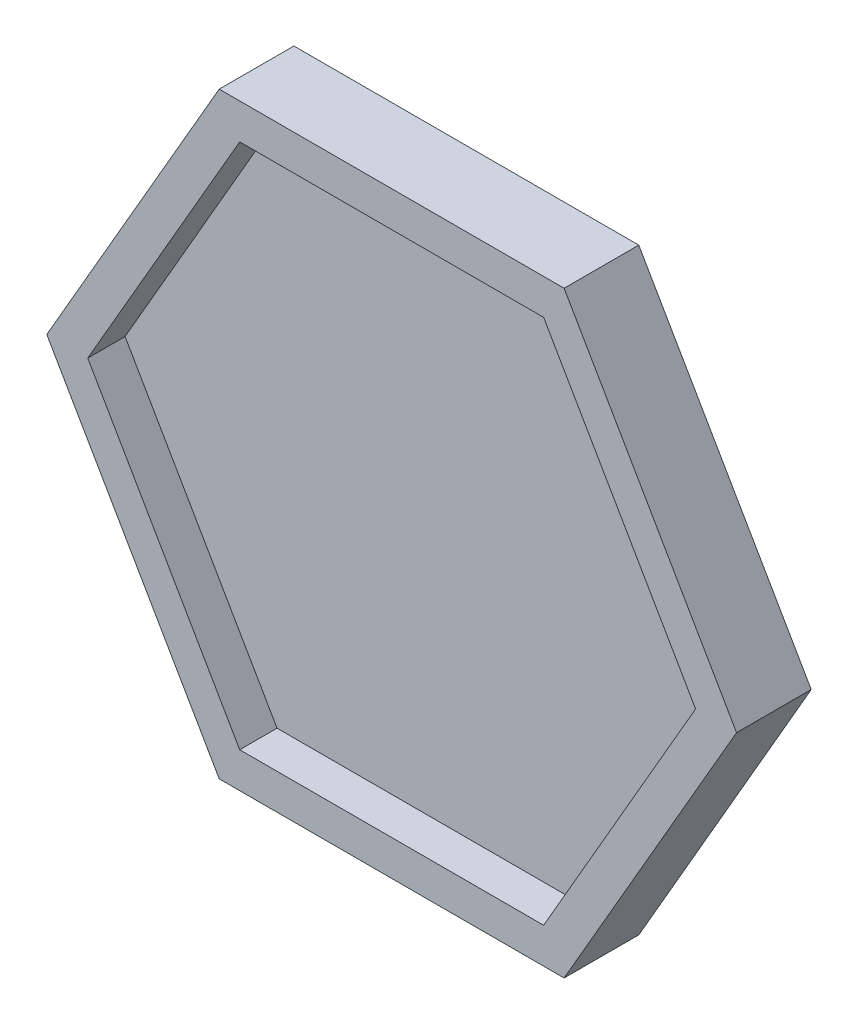
ISO-10303-21;
HEADER;
FILE_DESCRIPTION(('STEP AP214'),'2;1');
FILE_NAME('part.step','',(''),(''),'','','');
FILE_SCHEMA(('AUTOMOTIVE_DESIGN { 1 0 10303 214 1 1 1 1 }'));
ENDSEC;
DATA;
#1=APPLICATION_CONTEXT('core data for automotive mechanical design processes');
#2=APPLICATION_PROTOCOL_DEFINITION('international standard','automotive_design',2000,#1);
#3=PRODUCT_CONTEXT('',#1,'mechanical');
#4=PRODUCT('Part','Part','',(#3));
#5=PRODUCT_RELATED_PRODUCT_CATEGORY('part','',(#4));
#6=PRODUCT_DEFINITION_FORMATION('','',#4);
#7=PRODUCT_DEFINITION_CONTEXT('part definition',#1,'design');
#8=PRODUCT_DEFINITION('design','',#6,#7);
#9=PRODUCT_DEFINITION_SHAPE('','',#8);
#10=(LENGTH_UNIT() NAMED_UNIT(*) SI_UNIT(.MILLI.,.METRE.));
#11=(NAMED_UNIT(*) PLANE_ANGLE_UNIT() SI_UNIT($,.RADIAN.));
#12=(NAMED_UNIT(*) SI_UNIT($,.STERADIAN.) SOLID_ANGLE_UNIT());
#13=UNCERTAINTY_MEASURE_WITH_UNIT(LENGTH_MEASURE(1.E-05),#10,'distance_accuracy_value','');
#14=(GEOMETRIC_REPRESENTATION_CONTEXT(3) GLOBAL_UNCERTAINTY_ASSIGNED_CONTEXT((#13)) GLOBAL_UNIT_ASSIGNED_CONTEXT((#10,
#11,#12)) REPRESENTATION_CONTEXT('',''));
#15=CARTESIAN_POINT('',(0.,0.,0.));
#16=DIRECTION('',(0.,0.,1.));
#17=DIRECTION('',(1.,0.,0.));
#18=AXIS2_PLACEMENT_3D('',#15,#16,#17);
#19=CARTESIAN_POINT('',(0.,0.,-2.5));
#20=DIRECTION('',(0.,0.,-1.));
#21=DIRECTION('',(-1.,0.,0.));
#22=AXIS2_PLACEMENT_3D('',#19,#20,#21);
#23=PLANE('',#22);
#24=DIRECTION('',(-0.5,0.866025403784439,0.));
#25=VECTOR('',#24,1.);
#26=CARTESIAN_POINT('',(8.14063879557373,0.,-2.5));
#27=LINE('',#26,#25);
#28=CARTESIAN_POINT('',(8.14063879557373,0.,-2.5));
#29=VERTEX_POINT('',#28);
#30=CARTESIAN_POINT('',(4.07031939778686,7.05000000000001,-2.5));
#31=VERTEX_POINT('',#30);
#32=EDGE_CURVE('E140',#29,#31,#27,.T.);
#33=ORIENTED_EDGE('',*,*,#32,.T.);
#34=DIRECTION('',(-1.,0.,0.));
#35=VECTOR('',#34,1.);
#36=CARTESIAN_POINT('',(4.07031939778686,7.05000000000001,-2.5));
#37=LINE('',#36,#35);
#38=CARTESIAN_POINT('',(-4.07031939778686,7.05000000000001,-2.5));
#39=VERTEX_POINT('',#38);
#40=EDGE_CURVE('E170',#31,#39,#37,.T.);
#41=ORIENTED_EDGE('',*,*,#40,.T.);
#42=DIRECTION('',(-0.5,-0.866025403784439,0.));
#43=VECTOR('',#42,1.);
#44=CARTESIAN_POINT('',(-4.07031939778686,7.05000000000001,-2.5));
#45=LINE('',#44,#43);
#46=CARTESIAN_POINT('',(-8.14063879557373,0.,-2.5));
#47=VERTEX_POINT('',#46);
#48=EDGE_CURVE('E146',#39,#47,#45,.T.);
#49=ORIENTED_EDGE('',*,*,#48,.T.);
#50=DIRECTION('',(0.5,-0.866025403784439,0.));
#51=VECTOR('',#50,1.);
#52=CARTESIAN_POINT('',(-8.14063879557373,0.,-2.5));
#53=LINE('',#52,#51);
#54=CARTESIAN_POINT('',(-4.07031939778687,-7.05,-2.5));
#55=VERTEX_POINT('',#54);
#56=EDGE_CURVE('E175',#47,#55,#53,.T.);
#57=ORIENTED_EDGE('',*,*,#56,.T.);
#58=DIRECTION('',(1.,0.,0.));
#59=VECTOR('',#58,1.);
#60=CARTESIAN_POINT('',(-4.07031939778687,-7.05,-2.5));
#61=LINE('',#60,#59);
#62=CARTESIAN_POINT('',(4.07031939778686,-7.05000000000001,-2.5));
#63=VERTEX_POINT('',#62);
#64=EDGE_CURVE('E179',#55,#63,#61,.T.);
#65=ORIENTED_EDGE('',*,*,#64,.T.);
#66=DIRECTION('',(0.5,0.866025403784439,0.));
#67=VECTOR('',#66,1.);
#68=CARTESIAN_POINT('',(4.07031939778686,-7.05000000000001,-2.5));
#69=LINE('',#68,#67);
#70=EDGE_CURVE('E183',#63,#29,#69,.T.);
#71=ORIENTED_EDGE('',*,*,#70,.T.);
#72=EDGE_LOOP('',(#33,#41,#49,#57,#65,#71));
#73=FACE_BOUND('',#72,.T.);
#74=ADVANCED_FACE('F39',(#73),#23,.F.);
#75=CARTESIAN_POINT('',(0.,0.,-1.5));
#76=DIRECTION('',(0.,0.,1.));
#77=DIRECTION('',(1.,0.,0.));
#78=AXIS2_PLACEMENT_3D('',#75,#76,#77);
#79=PLANE('',#78);
#80=DIRECTION('',(-1.,0.,0.));
#81=VECTOR('',#80,1.);
#82=CARTESIAN_POINT('',(4.61880215351692,8.00000000000006,-1.5));
#83=LINE('',#82,#81);
#84=CARTESIAN_POINT('',(4.61880215351692,8.00000000000006,-1.5));
#85=VERTEX_POINT('',#84);
#86=CARTESIAN_POINT('',(-4.61880215351701,8.00000000000001,-1.5));
#87=VERTEX_POINT('',#86);
#88=EDGE_CURVE('E148',#85,#87,#83,.T.);
#89=ORIENTED_EDGE('',*,*,#88,.T.);
#90=DIRECTION('',(-0.499999999999999,-0.866025403784439,0.));
#91=VECTOR('',#90,1.);
#92=CARTESIAN_POINT('',(-4.61880215351701,8.00000000000001,-1.5));
#93=LINE('',#92,#91);
#94=CARTESIAN_POINT('',(-9.23760430703402,0.,-1.5));
#95=VERTEX_POINT('',#94);
#96=EDGE_CURVE('E206',#87,#95,#93,.T.);
#97=ORIENTED_EDGE('',*,*,#96,.T.);
#98=DIRECTION('',(0.500000000000003,-0.866025403784437,0.));
#99=VECTOR('',#98,1.);
#100=CARTESIAN_POINT('',(-9.23760430703402,0.,-1.5));
#101=LINE('',#100,#99);
#102=CARTESIAN_POINT('',(-4.61880215351698,-8.00000000000003,-1.5));
#103=VERTEX_POINT('',#102);
#104=EDGE_CURVE('E210',#95,#103,#101,.T.);
#105=ORIENTED_EDGE('',*,*,#104,.T.);
#106=DIRECTION('',(1.,0.,0.));
#107=VECTOR('',#106,1.);
#108=CARTESIAN_POINT('',(-4.61880215351698,-8.00000000000003,-1.5));
#109=LINE('',#108,#107);
#110=CARTESIAN_POINT('',(4.61880215351706,-7.99999999999998,-1.5));
#111=VERTEX_POINT('',#110);
#112=EDGE_CURVE('E214',#103,#111,#109,.T.);
#113=ORIENTED_EDGE('',*,*,#112,.T.);
#114=DIRECTION('',(0.499999999999994,0.866025403784442,0.));
#115=VECTOR('',#114,1.);
#116=CARTESIAN_POINT('',(4.61880215351706,-7.99999999999998,-1.5));
#117=LINE('',#116,#115);
#118=CARTESIAN_POINT('',(9.23760430703402,0.,-1.5));
#119=VERTEX_POINT('',#118);
#120=EDGE_CURVE('E218',#111,#119,#117,.T.);
#121=ORIENTED_EDGE('',*,*,#120,.T.);
#122=DIRECTION('',(-0.500000000000009,0.866025403784434,0.));
#123=VECTOR('',#122,1.);
#124=CARTESIAN_POINT('',(9.23760430703402,0.,-1.5));
#125=LINE('',#124,#123);
#126=EDGE_CURVE('E222',#119,#85,#125,.T.);
#127=ORIENTED_EDGE('',*,*,#126,.T.);
#128=EDGE_LOOP('',(#89,#97,#105,#113,#121,#127));
#129=FACE_BOUND('',#128,.T.);
#130=DIRECTION('',(-0.5,-0.866025403784439,0.));
#131=VECTOR('',#130,1.);
#132=CARTESIAN_POINT('',(-4.07031939778686,7.05000000000001,-1.5));
#133=LINE('',#132,#131);
#134=CARTESIAN_POINT('',(-4.07031939778686,7.05000000000001,-1.5));
#135=VERTEX_POINT('',#134);
#136=CARTESIAN_POINT('',(-8.14063879557373,0.,-1.5));
#137=VERTEX_POINT('',#136);
#138=EDGE_CURVE('E139',#135,#137,#133,.T.);
#139=ORIENTED_EDGE('',*,*,#138,.F.);
#140=DIRECTION('',(-1.,0.,0.));
#141=VECTOR('',#140,1.);
#142=CARTESIAN_POINT('',(4.07031939778686,7.05000000000001,-1.5));
#143=LINE('',#142,#141);
#144=CARTESIAN_POINT('',(4.07031939778686,7.05000000000001,-1.5));
#145=VERTEX_POINT('',#144);
#146=EDGE_CURVE('E130',#145,#135,#143,.T.);
#147=ORIENTED_EDGE('',*,*,#146,.F.);
#148=DIRECTION('',(-0.5,0.866025403784439,0.));
#149=VECTOR('',#148,1.);
#150=CARTESIAN_POINT('',(8.14063879557373,0.,-1.5));
#151=LINE('',#150,#149);
#152=CARTESIAN_POINT('',(8.14063879557373,0.,-1.5));
#153=VERTEX_POINT('',#152);
#154=EDGE_CURVE('E167',#153,#145,#151,.T.);
#155=ORIENTED_EDGE('',*,*,#154,.F.);
#156=DIRECTION('',(0.5,0.866025403784439,0.));
#157=VECTOR('',#156,1.);
#158=CARTESIAN_POINT('',(4.07031939778686,-7.05000000000001,-1.5));
#159=LINE('',#158,#157);
#160=CARTESIAN_POINT('',(4.07031939778686,-7.05000000000001,-1.5));
#161=VERTEX_POINT('',#160);
#162=EDGE_CURVE('E163',#161,#153,#159,.T.);
#163=ORIENTED_EDGE('',*,*,#162,.F.);
#164=DIRECTION('',(1.,0.,0.));
#165=VECTOR('',#164,1.);
#166=CARTESIAN_POINT('',(-4.07031939778687,-7.05,-1.5));
#167=LINE('',#166,#165);
#168=CARTESIAN_POINT('',(-4.07031939778687,-7.05,-1.5));
#169=VERTEX_POINT('',#168);
#170=EDGE_CURVE('E158',#169,#161,#167,.T.);
#171=ORIENTED_EDGE('',*,*,#170,.F.);
#172=DIRECTION('',(0.5,-0.866025403784439,0.));
#173=VECTOR('',#172,1.);
#174=CARTESIAN_POINT('',(-8.14063879557373,0.,-1.5));
#175=LINE('',#174,#173);
#176=EDGE_CURVE('E154',#137,#169,#175,.T.);
#177=ORIENTED_EDGE('',*,*,#176,.F.);
#178=EDGE_LOOP('',(#139,#147,#155,#163,#171,#177));
#179=FACE_BOUND('',#178,.T.);
#180=ADVANCED_FACE('F152',(#129,#179),#79,.T.);
#181=CARTESIAN_POINT('',(4.07031939778686,7.05000000000001,-1.5));
#182=DIRECTION('',(0.,-1.,0.));
#183=DIRECTION('',(1.,0.,0.));
#184=AXIS2_PLACEMENT_3D('',#181,#182,#183);
#185=PLANE('',#184);
#186=ORIENTED_EDGE('',*,*,#40,.F.);
#187=DIRECTION('',(0.,0.,-1.));
#188=VECTOR('',#187,1.);
#189=CARTESIAN_POINT('',(4.07031939778686,7.05000000000001,-1.5));
#190=LINE('',#189,#188);
#191=EDGE_CURVE('E55',#145,#31,#190,.T.);
#192=ORIENTED_EDGE('',*,*,#191,.F.);
#193=ORIENTED_EDGE('',*,*,#146,.T.);
#194=DIRECTION('',(0.,0.,-1.));
#195=VECTOR('',#194,1.);
#196=CARTESIAN_POINT('',(-4.07031939778686,7.05000000000001,-1.5));
#197=LINE('',#196,#195);
#198=EDGE_CURVE('E133',#135,#39,#197,.T.);
#199=ORIENTED_EDGE('',*,*,#198,.T.);
#200=EDGE_LOOP('',(#186,#192,#193,#199));
#201=FACE_BOUND('',#200,.T.);
#202=ADVANCED_FACE('F132',(#201),#185,.T.);
#203=CARTESIAN_POINT('',(-4.07031939778686,7.05000000000001,-1.5));
#204=DIRECTION('',(0.866025403784439,-0.5,0.));
#205=DIRECTION('',(0.5,0.866025403784439,0.));
#206=AXIS2_PLACEMENT_3D('',#203,#204,#205);
#207=PLANE('',#206);
#208=ORIENTED_EDGE('',*,*,#48,.F.);
#209=ORIENTED_EDGE('',*,*,#198,.F.);
#210=ORIENTED_EDGE('',*,*,#138,.T.);
#211=DIRECTION('',(0.,0.,-1.));
#212=VECTOR('',#211,1.);
#213=CARTESIAN_POINT('',(-8.14063879557373,0.,-1.5));
#214=LINE('',#213,#212);
#215=EDGE_CURVE('E149',#137,#47,#214,.T.);
#216=ORIENTED_EDGE('',*,*,#215,.T.);
#217=EDGE_LOOP('',(#208,#209,#210,#216));
#218=FACE_BOUND('',#217,.T.);
#219=ADVANCED_FACE('F143',(#218),#207,.T.);
#220=CARTESIAN_POINT('',(-8.14063879557373,0.,-1.5));
#221=DIRECTION('',(0.866025403784439,0.5,0.));
#222=DIRECTION('',(-0.5,0.866025403784439,0.));
#223=AXIS2_PLACEMENT_3D('',#220,#221,#222);
#224=PLANE('',#223);
#225=ORIENTED_EDGE('',*,*,#56,.F.);
#226=ORIENTED_EDGE('',*,*,#215,.F.);
#227=ORIENTED_EDGE('',*,*,#176,.T.);
#228=DIRECTION('',(0.,0.,-1.));
#229=VECTOR('',#228,1.);
#230=CARTESIAN_POINT('',(-4.07031939778687,-7.05,-1.5));
#231=LINE('',#230,#229);
#232=EDGE_CURVE('E198',#169,#55,#231,.T.);
#233=ORIENTED_EDGE('',*,*,#232,.T.);
#234=EDGE_LOOP('',(#225,#226,#227,#233));
#235=FACE_BOUND('',#234,.T.);
#236=ADVANCED_FACE('F306',(#235),#224,.T.);
#237=CARTESIAN_POINT('',(-4.07031939778687,-7.05,-1.5));
#238=DIRECTION('',(0.,1.,0.));
#239=DIRECTION('',(-1.,0.,0.));
#240=AXIS2_PLACEMENT_3D('',#237,#238,#239);
#241=PLANE('',#240);
#242=ORIENTED_EDGE('',*,*,#64,.F.);
#243=ORIENTED_EDGE('',*,*,#232,.F.);
#244=ORIENTED_EDGE('',*,*,#170,.T.);
#245=DIRECTION('',(0.,0.,-1.));
#246=VECTOR('',#245,1.);
#247=CARTESIAN_POINT('',(4.07031939778686,-7.05000000000001,-1.5));
#248=LINE('',#247,#246);
#249=EDGE_CURVE('E195',#161,#63,#248,.T.);
#250=ORIENTED_EDGE('',*,*,#249,.T.);
#251=EDGE_LOOP('',(#242,#243,#244,#250));
#252=FACE_BOUND('',#251,.T.);
#253=ADVANCED_FACE('F309',(#252),#241,.T.);
#254=CARTESIAN_POINT('',(4.07031939778686,-7.05000000000001,-1.5));
#255=DIRECTION('',(-0.866025403784439,0.5,0.));
#256=DIRECTION('',(-0.5,-0.866025403784439,0.));
#257=AXIS2_PLACEMENT_3D('',#254,#255,#256);
#258=PLANE('',#257);
#259=ORIENTED_EDGE('',*,*,#70,.F.);
#260=ORIENTED_EDGE('',*,*,#249,.F.);
#261=ORIENTED_EDGE('',*,*,#162,.T.);
#262=DIRECTION('',(0.,0.,-1.));
#263=VECTOR('',#262,1.);
#264=CARTESIAN_POINT('',(8.14063879557373,0.,-1.5));
#265=LINE('',#264,#263);
#266=EDGE_CURVE('E192',#153,#29,#265,.T.);
#267=ORIENTED_EDGE('',*,*,#266,.T.);
#268=EDGE_LOOP('',(#259,#260,#261,#267));
#269=FACE_BOUND('',#268,.T.);
#270=ADVANCED_FACE('F313',(#269),#258,.T.);
#271=CARTESIAN_POINT('',(8.14063879557373,0.,-1.5));
#272=DIRECTION('',(-0.866025403784439,-0.5,0.));
#273=DIRECTION('',(0.5,-0.866025403784439,0.));
#274=AXIS2_PLACEMENT_3D('',#271,#272,#273);
#275=PLANE('',#274);
#276=ORIENTED_EDGE('',*,*,#32,.F.);
#277=ORIENTED_EDGE('',*,*,#266,.F.);
#278=ORIENTED_EDGE('',*,*,#154,.T.);
#279=ORIENTED_EDGE('',*,*,#191,.T.);
#280=EDGE_LOOP('',(#276,#277,#278,#279));
#281=FACE_BOUND('',#280,.T.);
#282=ADVANCED_FACE('F300',(#281),#275,.T.);
#283=CARTESIAN_POINT('',(0.,0.,-3.5));
#284=DIRECTION('',(0.,0.,-1.));
#285=DIRECTION('',(-1.,0.,0.));
#286=AXIS2_PLACEMENT_3D('',#283,#284,#285);
#287=PLANE('',#286);
#288=DIRECTION('',(-0.5,0.866025403784439,0.));
#289=VECTOR('',#288,1.);
#290=CARTESIAN_POINT('',(-4.61880215351701,-8.00000000000001,-3.5));
#291=LINE('',#290,#289);
#292=CARTESIAN_POINT('',(-4.61880215351701,-8.00000000000001,-3.5));
#293=VERTEX_POINT('',#292);
#294=CARTESIAN_POINT('',(-9.23760430703402,0.,-3.5));
#295=VERTEX_POINT('',#294);
#296=EDGE_CURVE('E226',#293,#295,#291,.T.);
#297=ORIENTED_EDGE('',*,*,#296,.T.);
#298=DIRECTION('',(0.5,0.866025403784439,0.));
#299=VECTOR('',#298,1.);
#300=CARTESIAN_POINT('',(-9.23760430703402,0.,-3.5));
#301=LINE('',#300,#299);
#302=CARTESIAN_POINT('',(-4.61880215351701,8.00000000000001,-3.5));
#303=VERTEX_POINT('',#302);
#304=EDGE_CURVE('E229',#295,#303,#301,.T.);
#305=ORIENTED_EDGE('',*,*,#304,.T.);
#306=DIRECTION('',(1.,0.,0.));
#307=VECTOR('',#306,1.);
#308=CARTESIAN_POINT('',(-4.61880215351701,8.00000000000001,-3.5));
#309=LINE('',#308,#307);
#310=CARTESIAN_POINT('',(4.61880215351701,8.00000000000001,-3.5));
#311=VERTEX_POINT('',#310);
#312=EDGE_CURVE('E232',#303,#311,#309,.T.);
#313=ORIENTED_EDGE('',*,*,#312,.T.);
#314=DIRECTION('',(0.5,-0.866025403784439,0.));
#315=VECTOR('',#314,1.);
#316=CARTESIAN_POINT('',(4.61880215351701,8.00000000000001,-3.5));
#317=LINE('',#316,#315);
#318=CARTESIAN_POINT('',(9.23760430703402,0.,-3.5));
#319=VERTEX_POINT('',#318);
#320=EDGE_CURVE('E235',#311,#319,#317,.T.);
#321=ORIENTED_EDGE('',*,*,#320,.T.);
#322=DIRECTION('',(-0.5,-0.866025403784439,0.));
#323=VECTOR('',#322,1.);
#324=CARTESIAN_POINT('',(9.23760430703402,0.,-3.5));
#325=LINE('',#324,#323);
#326=CARTESIAN_POINT('',(4.61880215351701,-8.00000000000001,-3.5));
#327=VERTEX_POINT('',#326);
#328=EDGE_CURVE('E238',#319,#327,#325,.T.);
#329=ORIENTED_EDGE('',*,*,#328,.T.);
#330=DIRECTION('',(-1.,0.,0.));
#331=VECTOR('',#330,1.);
#332=CARTESIAN_POINT('',(4.61880215351701,-8.00000000000001,-3.5));
#333=LINE('',#332,#331);
#334=EDGE_CURVE('E63',#327,#293,#333,.T.);
#335=ORIENTED_EDGE('',*,*,#334,.T.);
#336=EDGE_LOOP('',(#297,#305,#313,#321,#329,#335));
#337=FACE_BOUND('',#336,.T.);
#338=ADVANCED_FACE('F274',(#337),#287,.T.);
#339=CARTESIAN_POINT('',(4.61880215351701,-8.00000000000001,-3.5));
#340=DIRECTION('',(0.,1.,0.));
#341=DIRECTION('',(0.,0.,1.));
#342=AXIS2_PLACEMENT_3D('',#339,#340,#341);
#343=PLANE('',#342);
#344=DIRECTION('',(0.,0.,1.));
#345=VECTOR('',#344,1.);
#346=CARTESIAN_POINT('',(4.61880215351701,-8.00000000000001,-3.5));
#347=LINE('',#346,#345);
#348=EDGE_CURVE('E246',#327,#111,#347,.T.);
#349=ORIENTED_EDGE('',*,*,#348,.T.);
#350=ORIENTED_EDGE('',*,*,#112,.F.);
#351=DIRECTION('',(0.,0.,1.));
#352=VECTOR('',#351,1.);
#353=CARTESIAN_POINT('',(-4.61880215351701,-8.00000000000001,-3.5));
#354=LINE('',#353,#352);
#355=EDGE_CURVE('E243',#293,#103,#354,.T.);
#356=ORIENTED_EDGE('',*,*,#355,.F.);
#357=ORIENTED_EDGE('',*,*,#334,.F.);
#358=EDGE_LOOP('',(#349,#350,#356,#357));
#359=FACE_BOUND('',#358,.T.);
#360=ADVANCED_FACE('F280',(#359),#343,.F.);
#361=CARTESIAN_POINT('',(9.23760430703402,0.,-3.5));
#362=DIRECTION('',(-0.866025403784439,0.5,0.));
#363=DIRECTION('',(-0.5,-0.866025403784439,0.));
#364=AXIS2_PLACEMENT_3D('',#361,#362,#363);
#365=PLANE('',#364);
#366=DIRECTION('',(0.,0.,1.));
#367=VECTOR('',#366,1.);
#368=CARTESIAN_POINT('',(9.23760430703402,0.,-3.5));
#369=LINE('',#368,#367);
#370=EDGE_CURVE('E249',#319,#119,#369,.T.);
#371=ORIENTED_EDGE('',*,*,#370,.T.);
#372=ORIENTED_EDGE('',*,*,#120,.F.);
#373=ORIENTED_EDGE('',*,*,#348,.F.);
#374=ORIENTED_EDGE('',*,*,#328,.F.);
#375=EDGE_LOOP('',(#371,#372,#373,#374));
#376=FACE_BOUND('',#375,.T.);
#377=ADVANCED_FACE('F282',(#376),#365,.F.);
#378=CARTESIAN_POINT('',(4.61880215351701,8.00000000000001,-3.5));
#379=DIRECTION('',(-0.866025403784439,-0.5,0.));
#380=DIRECTION('',(0.5,-0.866025403784439,0.));
#381=AXIS2_PLACEMENT_3D('',#378,#379,#380);
#382=PLANE('',#381);
#383=DIRECTION('',(0.,0.,1.));
#384=VECTOR('',#383,1.);
#385=CARTESIAN_POINT('',(4.61880215351701,8.00000000000001,-3.5));
#386=LINE('',#385,#384);
#387=EDGE_CURVE('E252',#311,#85,#386,.T.);
#388=ORIENTED_EDGE('',*,*,#387,.T.);
#389=ORIENTED_EDGE('',*,*,#126,.F.);
#390=ORIENTED_EDGE('',*,*,#370,.F.);
#391=ORIENTED_EDGE('',*,*,#320,.F.);
#392=EDGE_LOOP('',(#388,#389,#390,#391));
#393=FACE_BOUND('',#392,.T.);
#394=ADVANCED_FACE('F271',(#393),#382,.F.);
#395=CARTESIAN_POINT('',(-4.61880215351701,8.00000000000001,-3.5));
#396=DIRECTION('',(0.,-1.,0.));
#397=DIRECTION('',(1.,0.,0.));
#398=AXIS2_PLACEMENT_3D('',#395,#396,#397);
#399=PLANE('',#398);
#400=DIRECTION('',(0.,0.,1.));
#401=VECTOR('',#400,1.);
#402=CARTESIAN_POINT('',(-4.61880215351701,8.00000000000001,-3.5));
#403=LINE('',#402,#401);
#404=EDGE_CURVE('E48',#303,#87,#403,.T.);
#405=ORIENTED_EDGE('',*,*,#404,.T.);
#406=ORIENTED_EDGE('',*,*,#88,.F.);
#407=ORIENTED_EDGE('',*,*,#387,.F.);
#408=ORIENTED_EDGE('',*,*,#312,.F.);
#409=EDGE_LOOP('',(#405,#406,#407,#408));
#410=FACE_BOUND('',#409,.T.);
#411=ADVANCED_FACE('F260',(#410),#399,.F.);
#412=CARTESIAN_POINT('',(-9.23760430703402,0.,-3.5));
#413=DIRECTION('',(0.866025403784439,-0.5,0.));
#414=DIRECTION('',(0.5,0.866025403784439,0.));
#415=AXIS2_PLACEMENT_3D('',#412,#413,#414);
#416=PLANE('',#415);
#417=DIRECTION('',(0.,0.,1.));
#418=VECTOR('',#417,1.);
#419=CARTESIAN_POINT('',(-9.23760430703402,0.,-3.5));
#420=LINE('',#419,#418);
#421=EDGE_CURVE('E11',#295,#95,#420,.T.);
#422=ORIENTED_EDGE('',*,*,#421,.T.);
#423=ORIENTED_EDGE('',*,*,#96,.F.);
#424=ORIENTED_EDGE('',*,*,#404,.F.);
#425=ORIENTED_EDGE('',*,*,#304,.F.);
#426=EDGE_LOOP('',(#422,#423,#424,#425));
#427=FACE_BOUND('',#426,.T.);
#428=ADVANCED_FACE('F263',(#427),#416,.F.);
#429=CARTESIAN_POINT('',(-4.61880215351701,-8.00000000000001,-3.5));
#430=DIRECTION('',(0.866025403784439,0.5,0.));
#431=DIRECTION('',(-0.5,0.866025403784439,0.));
#432=AXIS2_PLACEMENT_3D('',#429,#430,#431);
#433=PLANE('',#432);
#434=ORIENTED_EDGE('',*,*,#355,.T.);
#435=ORIENTED_EDGE('',*,*,#104,.F.);
#436=ORIENTED_EDGE('',*,*,#421,.F.);
#437=ORIENTED_EDGE('',*,*,#296,.F.);
#438=EDGE_LOOP('',(#434,#435,#436,#437));
#439=FACE_BOUND('',#438,.T.);
#440=ADVANCED_FACE('F41',(#439),#433,.F.);
#441=CLOSED_SHELL('',(#74,#180,#202,#219,#236,#253,#270,#282,#338,#360,#377,#394,#411,#428,#440));
#442=MANIFOLD_SOLID_BREP('B2',#441);
#443=ADVANCED_BREP_SHAPE_REPRESENTATION('',(#18,#442),#14);
#444=SHAPE_DEFINITION_REPRESENTATION(#9,#443);
ENDSEC;
END-ISO-10303-21;
